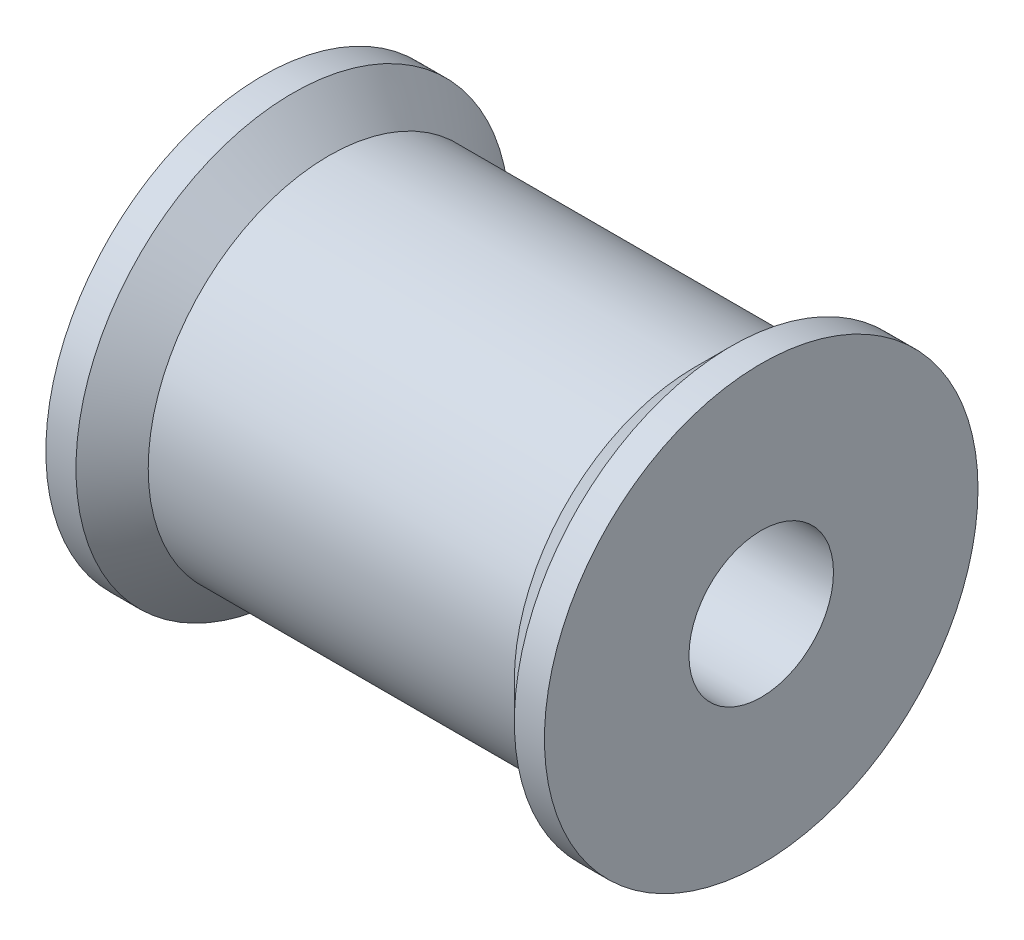
ISO-10303-21;
HEADER;
FILE_DESCRIPTION(('STEP AP214'),'2;1');
FILE_NAME('part.step','',(''),(''),'','','');
FILE_SCHEMA(('AUTOMOTIVE_DESIGN { 1 0 10303 214 1 1 1 1 }'));
ENDSEC;
DATA;
#1=APPLICATION_CONTEXT('core data for automotive mechanical design processes');
#2=APPLICATION_PROTOCOL_DEFINITION('international standard','automotive_design',2000,#1);
#3=PRODUCT_CONTEXT('',#1,'mechanical');
#4=PRODUCT('Part','Part','',(#3));
#5=PRODUCT_RELATED_PRODUCT_CATEGORY('part','',(#4));
#6=PRODUCT_DEFINITION_FORMATION('','',#4);
#7=PRODUCT_DEFINITION_CONTEXT('part definition',#1,'design');
#8=PRODUCT_DEFINITION('design','',#6,#7);
#9=PRODUCT_DEFINITION_SHAPE('','',#8);
#10=(LENGTH_UNIT() NAMED_UNIT(*) SI_UNIT(.MILLI.,.METRE.));
#11=(NAMED_UNIT(*) PLANE_ANGLE_UNIT() SI_UNIT($,.RADIAN.));
#12=(NAMED_UNIT(*) SI_UNIT($,.STERADIAN.) SOLID_ANGLE_UNIT());
#13=UNCERTAINTY_MEASURE_WITH_UNIT(LENGTH_MEASURE(1.E-05),#10,'distance_accuracy_value','');
#14=(GEOMETRIC_REPRESENTATION_CONTEXT(3) GLOBAL_UNCERTAINTY_ASSIGNED_CONTEXT((#13)) GLOBAL_UNIT_ASSIGNED_CONTEXT((#10,
#11,#12)) REPRESENTATION_CONTEXT('',''));
#15=CARTESIAN_POINT('',(0.,0.,0.));
#16=DIRECTION('',(0.,0.,1.));
#17=DIRECTION('',(1.,0.,0.));
#18=AXIS2_PLACEMENT_3D('',#15,#16,#17);
#19=CARTESIAN_POINT('',(-10.35,0.,-9.00000000000001));
#20=DIRECTION('',(-1.,0.,0.));
#21=DIRECTION('',(0.,0.,1.));
#22=AXIS2_PLACEMENT_3D('',#19,#20,#21);
#23=PLANE('',#22);
#24=CARTESIAN_POINT('',(-10.35,0.,0.));
#25=DIRECTION('',(-1.,0.,0.));
#26=DIRECTION('',(0.,0.,1.));
#27=AXIS2_PLACEMENT_3D('',#24,#25,#26);
#28=CIRCLE('',#27,3.);
#29=CARTESIAN_POINT('',(-10.35,0.,3.));
#30=VERTEX_POINT('',#29);
#31=EDGE_CURVE('E72',#30,#30,#28,.T.);
#32=ORIENTED_EDGE('',*,*,#31,.F.);
#33=EDGE_LOOP('',(#32));
#34=FACE_BOUND('',#33,.T.);
#35=CARTESIAN_POINT('',(-10.35,0.,0.));
#36=DIRECTION('',(1.,0.,0.));
#37=DIRECTION('',(0.,0.,-1.));
#38=AXIS2_PLACEMENT_3D('',#35,#36,#37);
#39=CIRCLE('',#38,9.);
#40=CARTESIAN_POINT('',(-10.35,0.,-9.00000000000001));
#41=VERTEX_POINT('',#40);
#42=EDGE_CURVE('E10',#41,#41,#39,.T.);
#43=ORIENTED_EDGE('',*,*,#42,.F.);
#44=EDGE_LOOP('',(#43));
#45=FACE_BOUND('',#44,.T.);
#46=ADVANCED_FACE('F37',(#34,#45),#23,.T.);
#47=CARTESIAN_POINT('',(10.35,0.,0.));
#48=DIRECTION('',(1.,0.,0.));
#49=DIRECTION('',(0.,0.,-1.));
#50=AXIS2_PLACEMENT_3D('',#47,#48,#49);
#51=CYLINDRICAL_SURFACE('',#50,9.);
#52=ORIENTED_EDGE('',*,*,#42,.T.);
#53=EDGE_LOOP('',(#52));
#54=FACE_BOUND('',#53,.T.);
#55=CARTESIAN_POINT('',(-9.10000000000001,0.,0.));
#56=DIRECTION('',(1.,0.,0.));
#57=DIRECTION('',(0.,0.,-1.));
#58=AXIS2_PLACEMENT_3D('',#55,#56,#57);
#59=CIRCLE('',#58,9.);
#60=CARTESIAN_POINT('',(-9.10000000000001,0.,-9.00000000000001));
#61=VERTEX_POINT('',#60);
#62=EDGE_CURVE('E44',#61,#61,#59,.T.);
#63=ORIENTED_EDGE('',*,*,#62,.F.);
#64=EDGE_LOOP('',(#63));
#65=FACE_BOUND('',#64,.T.);
#66=ADVANCED_FACE('F82',(#54,#65),#51,.T.);
#67=CARTESIAN_POINT('',(-7.6,0.,0.));
#68=DIRECTION('',(-1.,0.,0.));
#69=DIRECTION('',(0.,0.,1.));
#70=AXIS2_PLACEMENT_3D('',#67,#68,#69);
#71=CONICAL_SURFACE('',#70,7.49999999999999,0.785398163397448);
#72=ORIENTED_EDGE('',*,*,#62,.T.);
#73=EDGE_LOOP('',(#72));
#74=FACE_BOUND('',#73,.T.);
#75=CARTESIAN_POINT('',(-7.6,0.,0.));
#76=DIRECTION('',(1.,0.,0.));
#77=DIRECTION('',(0.,0.,-1.));
#78=AXIS2_PLACEMENT_3D('',#75,#76,#77);
#79=CIRCLE('',#78,7.49999999999999);
#80=CARTESIAN_POINT('',(-7.6,0.,-7.5));
#81=VERTEX_POINT('',#80);
#82=EDGE_CURVE('E49',#81,#81,#79,.T.);
#83=ORIENTED_EDGE('',*,*,#82,.F.);
#84=EDGE_LOOP('',(#83));
#85=FACE_BOUND('',#84,.T.);
#86=ADVANCED_FACE('F86',(#74,#85),#71,.T.);
#87=CARTESIAN_POINT('',(10.35,0.,0.));
#88=DIRECTION('',(1.,0.,0.));
#89=DIRECTION('',(0.,0.,-1.));
#90=AXIS2_PLACEMENT_3D('',#87,#88,#89);
#91=CYLINDRICAL_SURFACE('',#90,7.49999999999999);
#92=ORIENTED_EDGE('',*,*,#82,.T.);
#93=EDGE_LOOP('',(#92));
#94=FACE_BOUND('',#93,.T.);
#95=CARTESIAN_POINT('',(7.6,0.,0.));
#96=DIRECTION('',(1.,0.,0.));
#97=DIRECTION('',(0.,0.,-1.));
#98=AXIS2_PLACEMENT_3D('',#95,#96,#97);
#99=CIRCLE('',#98,7.5);
#100=CARTESIAN_POINT('',(7.6,0.,-7.5));
#101=VERTEX_POINT('',#100);
#102=EDGE_CURVE('E54',#101,#101,#99,.T.);
#103=ORIENTED_EDGE('',*,*,#102,.F.);
#104=EDGE_LOOP('',(#103));
#105=FACE_BOUND('',#104,.T.);
#106=ADVANCED_FACE('F90',(#94,#105),#91,.T.);
#107=CARTESIAN_POINT('',(9.1,0.,0.));
#108=DIRECTION('',(1.,0.,0.));
#109=DIRECTION('',(0.,0.,-1.));
#110=AXIS2_PLACEMENT_3D('',#107,#108,#109);
#111=CONICAL_SURFACE('',#110,9.00000000000001,0.785398163397449);
#112=ORIENTED_EDGE('',*,*,#102,.T.);
#113=EDGE_LOOP('',(#112));
#114=FACE_BOUND('',#113,.T.);
#115=CARTESIAN_POINT('',(9.1,0.,0.));
#116=DIRECTION('',(1.,0.,0.));
#117=DIRECTION('',(0.,0.,-1.));
#118=AXIS2_PLACEMENT_3D('',#115,#116,#117);
#119=CIRCLE('',#118,9.00000000000001);
#120=CARTESIAN_POINT('',(9.10000000000001,0.,-9.00000000000001));
#121=VERTEX_POINT('',#120);
#122=EDGE_CURVE('E60',#121,#121,#119,.T.);
#123=ORIENTED_EDGE('',*,*,#122,.F.);
#124=EDGE_LOOP('',(#123));
#125=FACE_BOUND('',#124,.T.);
#126=ADVANCED_FACE('F96',(#114,#125),#111,.T.);
#127=CARTESIAN_POINT('',(10.35,0.,0.));
#128=DIRECTION('',(1.,0.,0.));
#129=DIRECTION('',(0.,0.,-1.));
#130=AXIS2_PLACEMENT_3D('',#127,#128,#129);
#131=CYLINDRICAL_SURFACE('',#130,9.00000000000001);
#132=ORIENTED_EDGE('',*,*,#122,.T.);
#133=EDGE_LOOP('',(#132));
#134=FACE_BOUND('',#133,.T.);
#135=CARTESIAN_POINT('',(10.35,0.,0.));
#136=DIRECTION('',(1.,0.,0.));
#137=DIRECTION('',(0.,0.,-1.));
#138=AXIS2_PLACEMENT_3D('',#135,#136,#137);
#139=CIRCLE('',#138,9.00000000000001);
#140=CARTESIAN_POINT('',(10.35,0.,-9.00000000000001));
#141=VERTEX_POINT('',#140);
#142=EDGE_CURVE('E64',#141,#141,#139,.T.);
#143=ORIENTED_EDGE('',*,*,#142,.F.);
#144=EDGE_LOOP('',(#143));
#145=FACE_BOUND('',#144,.T.);
#146=ADVANCED_FACE('F100',(#134,#145),#131,.T.);
#147=CARTESIAN_POINT('',(10.35,0.,-9.00000000000001));
#148=DIRECTION('',(1.,0.,0.));
#149=DIRECTION('',(0.,0.,-1.));
#150=AXIS2_PLACEMENT_3D('',#147,#148,#149);
#151=PLANE('',#150);
#152=CARTESIAN_POINT('',(10.35,0.,0.));
#153=DIRECTION('',(1.,0.,0.));
#154=DIRECTION('',(0.,0.,-1.));
#155=AXIS2_PLACEMENT_3D('',#152,#153,#154);
#156=CIRCLE('',#155,3.);
#157=CARTESIAN_POINT('',(10.35,0.,-3.));
#158=VERTEX_POINT('',#157);
#159=EDGE_CURVE('E68',#158,#158,#156,.F.);
#160=ORIENTED_EDGE('',*,*,#159,.T.);
#161=EDGE_LOOP('',(#160));
#162=FACE_BOUND('',#161,.T.);
#163=ORIENTED_EDGE('',*,*,#142,.T.);
#164=EDGE_LOOP('',(#163));
#165=FACE_BOUND('',#164,.T.);
#166=ADVANCED_FACE('F104',(#162,#165),#151,.T.);
#167=CARTESIAN_POINT('',(18.8352813742386,0.,0.));
#168=DIRECTION('',(-1.,0.,0.));
#169=DIRECTION('',(0.,0.,1.));
#170=AXIS2_PLACEMENT_3D('',#167,#168,#169);
#171=CYLINDRICAL_SURFACE('',#170,3.);
#172=ORIENTED_EDGE('',*,*,#31,.T.);
#173=EDGE_LOOP('',(#172));
#174=FACE_BOUND('',#173,.T.);
#175=ORIENTED_EDGE('',*,*,#159,.F.);
#176=EDGE_LOOP('',(#175));
#177=FACE_BOUND('',#176,.T.);
#178=ADVANCED_FACE('F77',(#174,#177),#171,.F.);
#179=CLOSED_SHELL('',(#46,#66,#86,#106,#126,#146,#166,#178));
#180=MANIFOLD_SOLID_BREP('B2',#179);
#181=ADVANCED_BREP_SHAPE_REPRESENTATION('',(#18,#180),#14);
#182=SHAPE_DEFINITION_REPRESENTATION(#9,#181);
ENDSEC;
END-ISO-10303-21;
